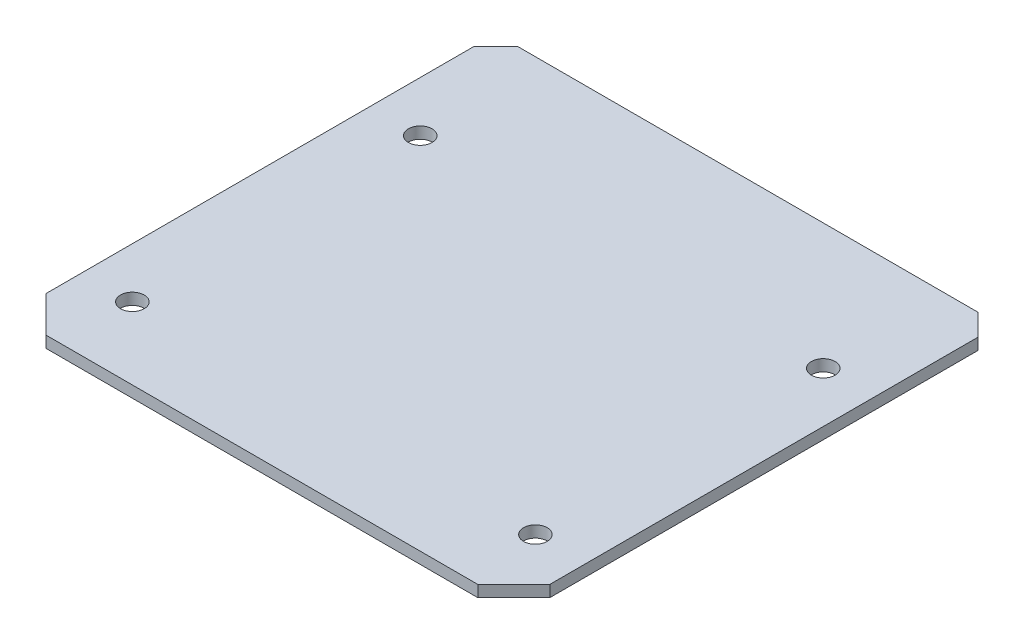
ISO-10303-21;
HEADER;
FILE_DESCRIPTION(('STEP AP214'),'2;1');
FILE_NAME('part.step','',(''),(''),'','','');
FILE_SCHEMA(('AUTOMOTIVE_DESIGN { 1 0 10303 214 1 1 1 1 }'));
ENDSEC;
DATA;
#1=APPLICATION_CONTEXT('core data for automotive mechanical design processes');
#2=APPLICATION_PROTOCOL_DEFINITION('international standard','automotive_design',2000,#1);
#3=PRODUCT_CONTEXT('',#1,'mechanical');
#4=PRODUCT('Part','Part','',(#3));
#5=PRODUCT_RELATED_PRODUCT_CATEGORY('part','',(#4));
#6=PRODUCT_DEFINITION_FORMATION('','',#4);
#7=PRODUCT_DEFINITION_CONTEXT('part definition',#1,'design');
#8=PRODUCT_DEFINITION('design','',#6,#7);
#9=PRODUCT_DEFINITION_SHAPE('','',#8);
#10=(LENGTH_UNIT() NAMED_UNIT(*) SI_UNIT(.MILLI.,.METRE.));
#11=(NAMED_UNIT(*) PLANE_ANGLE_UNIT() SI_UNIT($,.RADIAN.));
#12=(NAMED_UNIT(*) SI_UNIT($,.STERADIAN.) SOLID_ANGLE_UNIT());
#13=UNCERTAINTY_MEASURE_WITH_UNIT(LENGTH_MEASURE(1.E-05),#10,'distance_accuracy_value','');
#14=(GEOMETRIC_REPRESENTATION_CONTEXT(3) GLOBAL_UNCERTAINTY_ASSIGNED_CONTEXT((#13)) GLOBAL_UNIT_ASSIGNED_CONTEXT((#10,
#11,#12)) REPRESENTATION_CONTEXT('',''));
#15=CARTESIAN_POINT('',(0.,0.,0.));
#16=DIRECTION('',(0.,0.,1.));
#17=DIRECTION('',(1.,0.,0.));
#18=AXIS2_PLACEMENT_3D('',#15,#16,#17);
#19=CARTESIAN_POINT('',(35.,1.6,25.));
#20=DIRECTION('',(-1.,0.,0.));
#21=DIRECTION('',(0.,0.,1.));
#22=AXIS2_PLACEMENT_3D('',#19,#20,#21);
#23=PLANE('',#22);
#24=DIRECTION('',(0.,0.,-1.));
#25=VECTOR('',#24,1.);
#26=CARTESIAN_POINT('',(35.,0.,25.));
#27=LINE('',#26,#25);
#28=CARTESIAN_POINT('',(35.,0.,25.));
#29=VERTEX_POINT('',#28);
#30=CARTESIAN_POINT('',(35.,0.,-34.5));
#31=VERTEX_POINT('',#30);
#32=EDGE_CURVE('E111',#29,#31,#27,.T.);
#33=ORIENTED_EDGE('',*,*,#32,.T.);
#34=DIRECTION('',(0.,1.,0.));
#35=VECTOR('',#34,1.);
#36=CARTESIAN_POINT('',(35.,1.6,-34.5));
#37=LINE('',#36,#35);
#38=CARTESIAN_POINT('',(35.,1.6,-34.5));
#39=VERTEX_POINT('',#38);
#40=EDGE_CURVE('E58',#31,#39,#37,.T.);
#41=ORIENTED_EDGE('',*,*,#40,.T.);
#42=DIRECTION('',(0.,0.,-1.));
#43=VECTOR('',#42,1.);
#44=CARTESIAN_POINT('',(35.,1.6,25.));
#45=LINE('',#44,#43);
#46=CARTESIAN_POINT('',(35.,1.6,25.));
#47=VERTEX_POINT('',#46);
#48=EDGE_CURVE('E110',#47,#39,#45,.T.);
#49=ORIENTED_EDGE('',*,*,#48,.F.);
#50=DIRECTION('',(0.,-1.,0.));
#51=VECTOR('',#50,1.);
#52=CARTESIAN_POINT('',(35.,1.6,25.));
#53=LINE('',#52,#51);
#54=EDGE_CURVE('E121',#47,#29,#53,.T.);
#55=ORIENTED_EDGE('',*,*,#54,.T.);
#56=EDGE_LOOP('',(#33,#41,#49,#55));
#57=FACE_BOUND('',#56,.T.);
#58=ADVANCED_FACE('F35',(#57),#23,.F.);
#59=CARTESIAN_POINT('',(-35.,1.6,25.));
#60=DIRECTION('',(1.,0.,0.));
#61=DIRECTION('',(0.,0.,-1.));
#62=AXIS2_PLACEMENT_3D('',#59,#60,#61);
#63=PLANE('',#62);
#64=DIRECTION('',(0.,0.,1.));
#65=VECTOR('',#64,1.);
#66=CARTESIAN_POINT('',(-35.,1.6,25.));
#67=LINE('',#66,#65);
#68=CARTESIAN_POINT('',(-35.,1.6,-34.5));
#69=VERTEX_POINT('',#68);
#70=CARTESIAN_POINT('',(-35.,1.6,25.));
#71=VERTEX_POINT('',#70);
#72=EDGE_CURVE('E173',#69,#71,#67,.T.);
#73=ORIENTED_EDGE('',*,*,#72,.F.);
#74=DIRECTION('',(0.,-1.,0.));
#75=VECTOR('',#74,1.);
#76=CARTESIAN_POINT('',(-35.,1.6,-34.5));
#77=LINE('',#76,#75);
#78=CARTESIAN_POINT('',(-35.,0.,-34.5));
#79=VERTEX_POINT('',#78);
#80=EDGE_CURVE('E11',#69,#79,#77,.T.);
#81=ORIENTED_EDGE('',*,*,#80,.T.);
#82=DIRECTION('',(0.,0.,1.));
#83=VECTOR('',#82,1.);
#84=CARTESIAN_POINT('',(-35.,0.,25.));
#85=LINE('',#84,#83);
#86=CARTESIAN_POINT('',(-35.,0.,25.));
#87=VERTEX_POINT('',#86);
#88=EDGE_CURVE('E102',#79,#87,#85,.T.);
#89=ORIENTED_EDGE('',*,*,#88,.T.);
#90=DIRECTION('',(0.,-1.,0.));
#91=VECTOR('',#90,1.);
#92=CARTESIAN_POINT('',(-35.,1.6,25.));
#93=LINE('',#92,#91);
#94=EDGE_CURVE('E105',#71,#87,#93,.T.);
#95=ORIENTED_EDGE('',*,*,#94,.F.);
#96=EDGE_LOOP('',(#73,#81,#89,#95));
#97=FACE_BOUND('',#96,.T.);
#98=ADVANCED_FACE('F104',(#97),#63,.F.);
#99=CARTESIAN_POINT('',(0.,1.6,0.));
#100=DIRECTION('',(0.,-1.,0.));
#101=DIRECTION('',(0.,0.,-1.));
#102=AXIS2_PLACEMENT_3D('',#99,#100,#101);
#103=PLANE('',#102);
#104=CARTESIAN_POINT('',(28.,1.6,-20.));
#105=DIRECTION('',(0.,1.,0.));
#106=DIRECTION('',(0.,0.,1.));
#107=AXIS2_PLACEMENT_3D('',#104,#105,#106);
#108=CIRCLE('',#107,1.65);
#109=CARTESIAN_POINT('',(28.,1.6,-18.35));
#110=VERTEX_POINT('',#109);
#111=EDGE_CURVE('E161',#110,#110,#108,.T.);
#112=ORIENTED_EDGE('',*,*,#111,.F.);
#113=EDGE_LOOP('',(#112));
#114=FACE_BOUND('',#113,.T.);
#115=CARTESIAN_POINT('',(28.,1.6,20.));
#116=DIRECTION('',(0.,1.,0.));
#117=DIRECTION('',(0.,0.,1.));
#118=AXIS2_PLACEMENT_3D('',#115,#116,#117);
#119=CIRCLE('',#118,1.65);
#120=CARTESIAN_POINT('',(28.,1.6,21.65));
#121=VERTEX_POINT('',#120);
#122=EDGE_CURVE('E155',#121,#121,#119,.T.);
#123=ORIENTED_EDGE('',*,*,#122,.F.);
#124=EDGE_LOOP('',(#123));
#125=FACE_BOUND('',#124,.T.);
#126=CARTESIAN_POINT('',(-28.,1.6,20.));
#127=DIRECTION('',(0.,1.,0.));
#128=DIRECTION('',(0.,0.,1.));
#129=AXIS2_PLACEMENT_3D('',#126,#127,#128);
#130=CIRCLE('',#129,1.65);
#131=CARTESIAN_POINT('',(-28.,1.6,21.65));
#132=VERTEX_POINT('',#131);
#133=EDGE_CURVE('E148',#132,#132,#130,.T.);
#134=ORIENTED_EDGE('',*,*,#133,.F.);
#135=EDGE_LOOP('',(#134));
#136=FACE_BOUND('',#135,.T.);
#137=CARTESIAN_POINT('',(-28.,1.6,-20.));
#138=DIRECTION('',(0.,1.,0.));
#139=DIRECTION('',(0.,0.,1.));
#140=AXIS2_PLACEMENT_3D('',#137,#138,#139);
#141=CIRCLE('',#140,1.65);
#142=CARTESIAN_POINT('',(-28.,1.6,-18.35));
#143=VERTEX_POINT('',#142);
#144=EDGE_CURVE('E167',#143,#143,#141,.T.);
#145=ORIENTED_EDGE('',*,*,#144,.F.);
#146=EDGE_LOOP('',(#145));
#147=FACE_BOUND('',#146,.T.);
#148=ORIENTED_EDGE('',*,*,#48,.T.);
#149=DIRECTION('',(0.707106781186546,0.,0.707106781186549));
#150=VECTOR('',#149,1.);
#151=CARTESIAN_POINT('',(32.,1.6,-37.5));
#152=LINE('',#151,#150);
#153=CARTESIAN_POINT('',(32.,1.6,-37.5));
#154=VERTEX_POINT('',#153);
#155=EDGE_CURVE('E43',#39,#154,#152,.F.);
#156=ORIENTED_EDGE('',*,*,#155,.T.);
#157=DIRECTION('',(1.,0.,0.));
#158=VECTOR('',#157,1.);
#159=CARTESIAN_POINT('',(-35.,1.6,-37.5));
#160=LINE('',#159,#158);
#161=CARTESIAN_POINT('',(-32.,1.6,-37.5));
#162=VERTEX_POINT('',#161);
#163=EDGE_CURVE('E128',#162,#154,#160,.T.);
#164=ORIENTED_EDGE('',*,*,#163,.F.);
#165=DIRECTION('',(0.707106781186549,0.,-0.707106781186546));
#166=VECTOR('',#165,1.);
#167=CARTESIAN_POINT('',(-35.,1.6,-34.5));
#168=LINE('',#167,#166);
#169=EDGE_CURVE('E50',#162,#69,#168,.F.);
#170=ORIENTED_EDGE('',*,*,#169,.T.);
#171=ORIENTED_EDGE('',*,*,#72,.T.);
#172=DIRECTION('',(-0.707106781186551,0.,-0.707106781186544));
#173=VECTOR('',#172,1.);
#174=CARTESIAN_POINT('',(-35.,1.6,25.));
#175=LINE('',#174,#173);
#176=CARTESIAN_POINT('',(-29.9999999999999,1.6,30.));
#177=VERTEX_POINT('',#176);
#178=EDGE_CURVE('E119',#177,#71,#175,.T.);
#179=ORIENTED_EDGE('',*,*,#178,.F.);
#180=DIRECTION('',(-1.,0.,0.));
#181=VECTOR('',#180,1.);
#182=CARTESIAN_POINT('',(-29.9999999999999,1.6,30.));
#183=LINE('',#182,#181);
#184=CARTESIAN_POINT('',(30.,1.6,30.));
#185=VERTEX_POINT('',#184);
#186=EDGE_CURVE('E147',#185,#177,#183,.T.);
#187=ORIENTED_EDGE('',*,*,#186,.F.);
#188=DIRECTION('',(-0.707106781186551,0.,0.707106781186544));
#189=VECTOR('',#188,1.);
#190=CARTESIAN_POINT('',(30.,1.6,30.));
#191=LINE('',#190,#189);
#192=EDGE_CURVE('E144',#47,#185,#191,.T.);
#193=ORIENTED_EDGE('',*,*,#192,.F.);
#194=EDGE_LOOP('',(#148,#156,#164,#170,#171,#179,#187,#193));
#195=FACE_BOUND('',#194,.T.);
#196=ADVANCED_FACE('F187',(#114,#125,#136,#147,#195),#103,.F.);
#197=CARTESIAN_POINT('',(0.,0.,0.));
#198=DIRECTION('',(0.,-1.,0.));
#199=DIRECTION('',(0.,0.,-1.));
#200=AXIS2_PLACEMENT_3D('',#197,#198,#199);
#201=PLANE('',#200);
#202=CARTESIAN_POINT('',(28.,0.,-20.));
#203=DIRECTION('',(0.,-1.,0.));
#204=DIRECTION('',(0.,0.,-1.));
#205=AXIS2_PLACEMENT_3D('',#202,#203,#204);
#206=CIRCLE('',#205,1.65);
#207=CARTESIAN_POINT('',(28.,0.,-21.65));
#208=VERTEX_POINT('',#207);
#209=EDGE_CURVE('E164',#208,#208,#206,.F.);
#210=ORIENTED_EDGE('',*,*,#209,.T.);
#211=EDGE_LOOP('',(#210));
#212=FACE_BOUND('',#211,.T.);
#213=CARTESIAN_POINT('',(28.,0.,20.));
#214=DIRECTION('',(0.,-1.,0.));
#215=DIRECTION('',(0.,0.,-1.));
#216=AXIS2_PLACEMENT_3D('',#213,#214,#215);
#217=CIRCLE('',#216,1.65);
#218=CARTESIAN_POINT('',(28.,0.,18.35));
#219=VERTEX_POINT('',#218);
#220=EDGE_CURVE('E158',#219,#219,#217,.F.);
#221=ORIENTED_EDGE('',*,*,#220,.T.);
#222=EDGE_LOOP('',(#221));
#223=FACE_BOUND('',#222,.T.);
#224=CARTESIAN_POINT('',(-28.,0.,20.));
#225=DIRECTION('',(0.,-1.,0.));
#226=DIRECTION('',(0.,0.,-1.));
#227=AXIS2_PLACEMENT_3D('',#224,#225,#226);
#228=CIRCLE('',#227,1.65);
#229=CARTESIAN_POINT('',(-28.,0.,18.35));
#230=VERTEX_POINT('',#229);
#231=EDGE_CURVE('E152',#230,#230,#228,.F.);
#232=ORIENTED_EDGE('',*,*,#231,.T.);
#233=EDGE_LOOP('',(#232));
#234=FACE_BOUND('',#233,.T.);
#235=CARTESIAN_POINT('',(-28.,0.,-20.));
#236=DIRECTION('',(0.,-1.,0.));
#237=DIRECTION('',(0.,0.,-1.));
#238=AXIS2_PLACEMENT_3D('',#235,#236,#237);
#239=CIRCLE('',#238,1.65);
#240=CARTESIAN_POINT('',(-28.,0.,-21.65));
#241=VERTEX_POINT('',#240);
#242=EDGE_CURVE('E151',#241,#241,#239,.F.);
#243=ORIENTED_EDGE('',*,*,#242,.T.);
#244=EDGE_LOOP('',(#243));
#245=FACE_BOUND('',#244,.T.);
#246=DIRECTION('',(-1.,0.,0.));
#247=VECTOR('',#246,1.);
#248=CARTESIAN_POINT('',(-35.,0.,-37.5));
#249=LINE('',#248,#247);
#250=CARTESIAN_POINT('',(32.,0.,-37.5));
#251=VERTEX_POINT('',#250);
#252=CARTESIAN_POINT('',(-32.,0.,-37.5));
#253=VERTEX_POINT('',#252);
#254=EDGE_CURVE('E133',#251,#253,#249,.T.);
#255=ORIENTED_EDGE('',*,*,#254,.F.);
#256=DIRECTION('',(-0.707106781186546,0.,-0.707106781186549));
#257=VECTOR('',#256,1.);
#258=CARTESIAN_POINT('',(34.7500000000001,0.,-34.7499999999999));
#259=LINE('',#258,#257);
#260=EDGE_CURVE('E183',#251,#31,#259,.F.);
#261=ORIENTED_EDGE('',*,*,#260,.T.);
#262=ORIENTED_EDGE('',*,*,#32,.F.);
#263=DIRECTION('',(0.707106781186551,0.,-0.707106781186544));
#264=VECTOR('',#263,1.);
#265=CARTESIAN_POINT('',(30.,0.,30.));
#266=LINE('',#265,#264);
#267=CARTESIAN_POINT('',(30.,0.,30.));
#268=VERTEX_POINT('',#267);
#269=EDGE_CURVE('E130',#268,#29,#266,.T.);
#270=ORIENTED_EDGE('',*,*,#269,.F.);
#271=DIRECTION('',(1.,0.,0.));
#272=VECTOR('',#271,1.);
#273=CARTESIAN_POINT('',(-29.9999999999999,0.,30.));
#274=LINE('',#273,#272);
#275=CARTESIAN_POINT('',(-29.9999999999999,0.,30.));
#276=VERTEX_POINT('',#275);
#277=EDGE_CURVE('E127',#276,#268,#274,.T.);
#278=ORIENTED_EDGE('',*,*,#277,.F.);
#279=DIRECTION('',(0.707106781186551,0.,0.707106781186544));
#280=VECTOR('',#279,1.);
#281=CARTESIAN_POINT('',(-35.,0.,25.));
#282=LINE('',#281,#280);
#283=EDGE_CURVE('E117',#87,#276,#282,.T.);
#284=ORIENTED_EDGE('',*,*,#283,.F.);
#285=ORIENTED_EDGE('',*,*,#88,.F.);
#286=DIRECTION('',(-0.707106781186549,0.,0.707106781186546));
#287=VECTOR('',#286,1.);
#288=CARTESIAN_POINT('',(-34.7499999999999,0.,-34.7500000000001));
#289=LINE('',#288,#287);
#290=EDGE_CURVE('E181',#79,#253,#289,.F.);
#291=ORIENTED_EDGE('',*,*,#290,.T.);
#292=EDGE_LOOP('',(#255,#261,#262,#270,#278,#284,#285,#291));
#293=FACE_BOUND('',#292,.T.);
#294=ADVANCED_FACE('F124',(#212,#223,#234,#245,#293),#201,.T.);
#295=CARTESIAN_POINT('',(-28.,-0.000999999999999916,-20.));
#296=DIRECTION('',(0.,1.,0.));
#297=DIRECTION('',(0.,0.,1.));
#298=AXIS2_PLACEMENT_3D('',#295,#296,#297);
#299=CYLINDRICAL_SURFACE('',#298,1.65);
#300=ORIENTED_EDGE('',*,*,#242,.F.);
#301=EDGE_LOOP('',(#300));
#302=FACE_BOUND('',#301,.T.);
#303=ORIENTED_EDGE('',*,*,#144,.T.);
#304=EDGE_LOOP('',(#303));
#305=FACE_BOUND('',#304,.T.);
#306=ADVANCED_FACE('F220',(#302,#305),#299,.F.);
#307=CARTESIAN_POINT('',(-28.,-0.000999999999999916,20.));
#308=DIRECTION('',(0.,1.,0.));
#309=DIRECTION('',(0.,0.,1.));
#310=AXIS2_PLACEMENT_3D('',#307,#308,#309);
#311=CYLINDRICAL_SURFACE('',#310,1.65);
#312=ORIENTED_EDGE('',*,*,#231,.F.);
#313=EDGE_LOOP('',(#312));
#314=FACE_BOUND('',#313,.T.);
#315=ORIENTED_EDGE('',*,*,#133,.T.);
#316=EDGE_LOOP('',(#315));
#317=FACE_BOUND('',#316,.T.);
#318=ADVANCED_FACE('F227',(#314,#317),#311,.F.);
#319=CARTESIAN_POINT('',(28.,-0.000999999999999916,20.));
#320=DIRECTION('',(0.,1.,0.));
#321=DIRECTION('',(0.,0.,1.));
#322=AXIS2_PLACEMENT_3D('',#319,#320,#321);
#323=CYLINDRICAL_SURFACE('',#322,1.65);
#324=ORIENTED_EDGE('',*,*,#220,.F.);
#325=EDGE_LOOP('',(#324));
#326=FACE_BOUND('',#325,.T.);
#327=ORIENTED_EDGE('',*,*,#122,.T.);
#328=EDGE_LOOP('',(#327));
#329=FACE_BOUND('',#328,.T.);
#330=ADVANCED_FACE('F232',(#326,#329),#323,.F.);
#331=CARTESIAN_POINT('',(28.,-0.000999999999999916,-20.));
#332=DIRECTION('',(0.,1.,0.));
#333=DIRECTION('',(0.,0.,1.));
#334=AXIS2_PLACEMENT_3D('',#331,#332,#333);
#335=CYLINDRICAL_SURFACE('',#334,1.65);
#336=ORIENTED_EDGE('',*,*,#209,.F.);
#337=EDGE_LOOP('',(#336));
#338=FACE_BOUND('',#337,.T.);
#339=ORIENTED_EDGE('',*,*,#111,.T.);
#340=EDGE_LOOP('',(#339));
#341=FACE_BOUND('',#340,.T.);
#342=ADVANCED_FACE('F229',(#338,#341),#335,.F.);
#343=CARTESIAN_POINT('',(30.,72.7073132666395,30.));
#344=DIRECTION('',(-0.707106781186544,0.,-0.707106781186551));
#345=DIRECTION('',(-0.707106781186551,0.,0.707106781186544));
#346=AXIS2_PLACEMENT_3D('',#343,#344,#345);
#347=PLANE('',#346);
#348=ORIENTED_EDGE('',*,*,#54,.F.);
#349=ORIENTED_EDGE('',*,*,#192,.T.);
#350=DIRECTION('',(0.,-1.,0.));
#351=VECTOR('',#350,1.);
#352=CARTESIAN_POINT('',(30.,72.7073132666395,30.));
#353=LINE('',#352,#351);
#354=EDGE_CURVE('E140',#185,#268,#353,.T.);
#355=ORIENTED_EDGE('',*,*,#354,.T.);
#356=ORIENTED_EDGE('',*,*,#269,.T.);
#357=EDGE_LOOP('',(#348,#349,#355,#356));
#358=FACE_BOUND('',#357,.T.);
#359=ADVANCED_FACE('F199',(#358),#347,.F.);
#360=CARTESIAN_POINT('',(-29.9999999999999,72.7073132666395,30.));
#361=DIRECTION('',(0.,0.,-1.));
#362=DIRECTION('',(-1.,0.,0.));
#363=AXIS2_PLACEMENT_3D('',#360,#361,#362);
#364=PLANE('',#363);
#365=ORIENTED_EDGE('',*,*,#354,.F.);
#366=ORIENTED_EDGE('',*,*,#186,.T.);
#367=DIRECTION('',(0.,-1.,0.));
#368=VECTOR('',#367,1.);
#369=CARTESIAN_POINT('',(-29.9999999999999,72.7073132666395,30.));
#370=LINE('',#369,#368);
#371=EDGE_CURVE('E142',#177,#276,#370,.T.);
#372=ORIENTED_EDGE('',*,*,#371,.T.);
#373=ORIENTED_EDGE('',*,*,#277,.T.);
#374=EDGE_LOOP('',(#365,#366,#372,#373));
#375=FACE_BOUND('',#374,.T.);
#376=ADVANCED_FACE('F203',(#375),#364,.F.);
#377=CARTESIAN_POINT('',(-35.,72.7073132666395,25.));
#378=DIRECTION('',(0.707106781186544,0.,-0.707106781186551));
#379=DIRECTION('',(-0.707106781186551,0.,-0.707106781186544));
#380=AXIS2_PLACEMENT_3D('',#377,#378,#379);
#381=PLANE('',#380);
#382=ORIENTED_EDGE('',*,*,#371,.F.);
#383=ORIENTED_EDGE('',*,*,#178,.T.);
#384=ORIENTED_EDGE('',*,*,#94,.T.);
#385=ORIENTED_EDGE('',*,*,#283,.T.);
#386=EDGE_LOOP('',(#382,#383,#384,#385));
#387=FACE_BOUND('',#386,.T.);
#388=ADVANCED_FACE('F116',(#387),#381,.F.);
#389=CARTESIAN_POINT('',(-35.,72.7073132666395,-37.5));
#390=DIRECTION('',(0.,0.,1.));
#391=DIRECTION('',(1.,0.,0.));
#392=AXIS2_PLACEMENT_3D('',#389,#390,#391);
#393=PLANE('',#392);
#394=ORIENTED_EDGE('',*,*,#163,.T.);
#395=DIRECTION('',(0.,-1.,0.));
#396=VECTOR('',#395,1.);
#397=CARTESIAN_POINT('',(32.,72.7073132666395,-37.5));
#398=LINE('',#397,#396);
#399=EDGE_CURVE('E178',#154,#251,#398,.T.);
#400=ORIENTED_EDGE('',*,*,#399,.T.);
#401=ORIENTED_EDGE('',*,*,#254,.T.);
#402=DIRECTION('',(0.,1.,0.));
#403=VECTOR('',#402,1.);
#404=CARTESIAN_POINT('',(-32.,72.7073132666395,-37.5));
#405=LINE('',#404,#403);
#406=EDGE_CURVE('E120',#253,#162,#405,.T.);
#407=ORIENTED_EDGE('',*,*,#406,.T.);
#408=EDGE_LOOP('',(#394,#400,#401,#407));
#409=FACE_BOUND('',#408,.T.);
#410=ADVANCED_FACE('F192',(#409),#393,.F.);
#411=CARTESIAN_POINT('',(32.,72.7073132666395,-37.5));
#412=DIRECTION('',(-0.707106781186549,0.,0.707106781186546));
#413=DIRECTION('',(0.,-1.,0.));
#414=AXIS2_PLACEMENT_3D('',#411,#412,#413);
#415=PLANE('',#414);
#416=ORIENTED_EDGE('',*,*,#155,.F.);
#417=ORIENTED_EDGE('',*,*,#40,.F.);
#418=ORIENTED_EDGE('',*,*,#260,.F.);
#419=ORIENTED_EDGE('',*,*,#399,.F.);
#420=EDGE_LOOP('',(#416,#417,#418,#419));
#421=FACE_BOUND('',#420,.T.);
#422=ADVANCED_FACE('F195',(#421),#415,.F.);
#423=CARTESIAN_POINT('',(-35.,1.6,-34.5));
#424=DIRECTION('',(0.707106781186546,0.,0.707106781186549));
#425=DIRECTION('',(0.,-1.,0.));
#426=AXIS2_PLACEMENT_3D('',#423,#424,#425);
#427=PLANE('',#426);
#428=ORIENTED_EDGE('',*,*,#169,.F.);
#429=ORIENTED_EDGE('',*,*,#406,.F.);
#430=ORIENTED_EDGE('',*,*,#290,.F.);
#431=ORIENTED_EDGE('',*,*,#80,.F.);
#432=EDGE_LOOP('',(#428,#429,#430,#431));
#433=FACE_BOUND('',#432,.T.);
#434=ADVANCED_FACE('F37',(#433),#427,.F.);
#435=CLOSED_SHELL('',(#58,#98,#196,#294,#306,#318,#330,#342,#359,#376,#388,#410,#422,#434));
#436=MANIFOLD_SOLID_BREP('B2',#435);
#437=ADVANCED_BREP_SHAPE_REPRESENTATION('',(#18,#436),#14);
#438=SHAPE_DEFINITION_REPRESENTATION(#9,#437);
ENDSEC;
END-ISO-10303-21;
